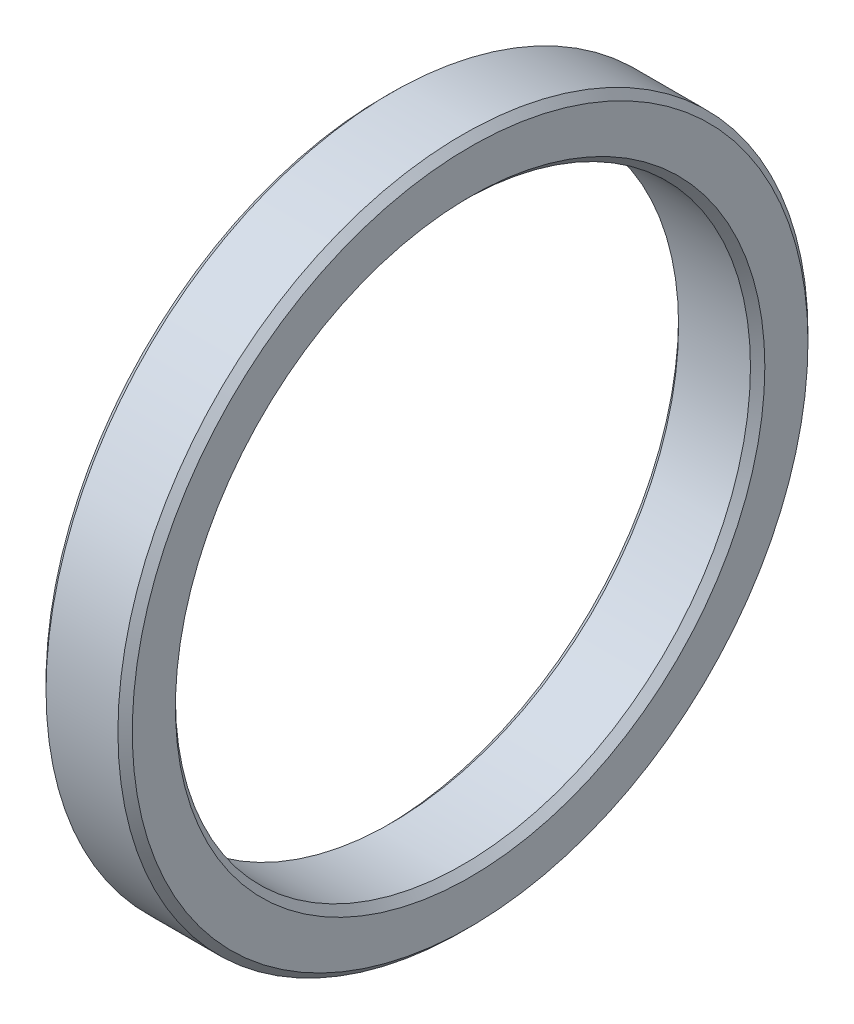
ISO-10303-21;
HEADER;
FILE_DESCRIPTION(('STEP AP214'),'2;1');
FILE_NAME('part.step','',(''),(''),'','','');
FILE_SCHEMA(('AUTOMOTIVE_DESIGN { 1 0 10303 214 1 1 1 1 }'));
ENDSEC;
DATA;
#1=APPLICATION_CONTEXT('core data for automotive mechanical design processes');
#2=APPLICATION_PROTOCOL_DEFINITION('international standard','automotive_design',2000,#1);
#3=PRODUCT_CONTEXT('',#1,'mechanical');
#4=PRODUCT('Part','Part','',(#3));
#5=PRODUCT_RELATED_PRODUCT_CATEGORY('part','',(#4));
#6=PRODUCT_DEFINITION_FORMATION('','',#4);
#7=PRODUCT_DEFINITION_CONTEXT('part definition',#1,'design');
#8=PRODUCT_DEFINITION('design','',#6,#7);
#9=PRODUCT_DEFINITION_SHAPE('','',#8);
#10=(LENGTH_UNIT() NAMED_UNIT(*) SI_UNIT(.MILLI.,.METRE.));
#11=(NAMED_UNIT(*) PLANE_ANGLE_UNIT() SI_UNIT($,.RADIAN.));
#12=(NAMED_UNIT(*) SI_UNIT($,.STERADIAN.) SOLID_ANGLE_UNIT());
#13=UNCERTAINTY_MEASURE_WITH_UNIT(LENGTH_MEASURE(1.E-05),#10,'distance_accuracy_value','');
#14=(GEOMETRIC_REPRESENTATION_CONTEXT(3) GLOBAL_UNCERTAINTY_ASSIGNED_CONTEXT((#13)) GLOBAL_UNIT_ASSIGNED_CONTEXT((#10,
#11,#12)) REPRESENTATION_CONTEXT('',''));
#15=CARTESIAN_POINT('',(0.,0.,0.));
#16=DIRECTION('',(0.,0.,1.));
#17=DIRECTION('',(1.,0.,0.));
#18=AXIS2_PLACEMENT_3D('',#15,#16,#17);
#19=CARTESIAN_POINT('',(6.,0.,0.));
#20=DIRECTION('',(1.,0.,0.));
#21=DIRECTION('',(0.,0.,-1.));
#22=AXIS2_PLACEMENT_3D('',#19,#20,#21);
#23=PLANE('',#22);
#24=CARTESIAN_POINT('',(6.,0.,0.));
#25=DIRECTION('',(1.,0.,0.));
#26=DIRECTION('',(0.,0.,-1.));
#27=AXIS2_PLACEMENT_3D('',#24,#25,#26);
#28=CIRCLE('',#27,23.5);
#29=CARTESIAN_POINT('',(6.,0.,-23.5));
#30=VERTEX_POINT('',#29);
#31=EDGE_CURVE('E47',#30,#30,#28,.T.);
#32=ORIENTED_EDGE('',*,*,#31,.T.);
#33=EDGE_LOOP('',(#32));
#34=FACE_BOUND('',#33,.T.);
#35=CARTESIAN_POINT('',(6.,0.,0.));
#36=DIRECTION('',(1.,0.,0.));
#37=DIRECTION('',(0.,0.,-1.));
#38=AXIS2_PLACEMENT_3D('',#35,#36,#37);
#39=CIRCLE('',#38,20.5);
#40=CARTESIAN_POINT('',(6.,0.,-20.5));
#41=VERTEX_POINT('',#40);
#42=EDGE_CURVE('E51',#41,#41,#39,.F.);
#43=ORIENTED_EDGE('',*,*,#42,.T.);
#44=EDGE_LOOP('',(#43));
#45=FACE_BOUND('',#44,.T.);
#46=ADVANCED_FACE('F35',(#34,#45),#23,.T.);
#47=CARTESIAN_POINT('',(0.,0.,0.));
#48=DIRECTION('',(1.,0.,0.));
#49=DIRECTION('',(0.,0.,-1.));
#50=AXIS2_PLACEMENT_3D('',#47,#48,#49);
#51=PLANE('',#50);
#52=CARTESIAN_POINT('',(0.,0.,0.));
#53=DIRECTION('',(1.,0.,0.));
#54=DIRECTION('',(0.,0.,-1.));
#55=AXIS2_PLACEMENT_3D('',#52,#53,#54);
#56=CIRCLE('',#55,23.5);
#57=CARTESIAN_POINT('',(0.,0.,-23.5));
#58=VERTEX_POINT('',#57);
#59=EDGE_CURVE('E56',#58,#58,#56,.F.);
#60=ORIENTED_EDGE('',*,*,#59,.T.);
#61=EDGE_LOOP('',(#60));
#62=FACE_BOUND('',#61,.T.);
#63=CARTESIAN_POINT('',(0.,0.,0.));
#64=DIRECTION('',(1.,0.,0.));
#65=DIRECTION('',(0.,0.,-1.));
#66=AXIS2_PLACEMENT_3D('',#63,#64,#65);
#67=CIRCLE('',#66,20.5);
#68=CARTESIAN_POINT('',(0.,0.,-20.5));
#69=VERTEX_POINT('',#68);
#70=EDGE_CURVE('E59',#69,#69,#67,.T.);
#71=ORIENTED_EDGE('',*,*,#70,.T.);
#72=EDGE_LOOP('',(#71));
#73=FACE_BOUND('',#72,.T.);
#74=ADVANCED_FACE('F81',(#62,#73),#51,.F.);
#75=CARTESIAN_POINT('',(6.,0.,0.));
#76=DIRECTION('',(-1.,0.,0.));
#77=DIRECTION('',(0.,0.,1.));
#78=AXIS2_PLACEMENT_3D('',#75,#76,#77);
#79=CYLINDRICAL_SURFACE('',#78,24.);
#80=CARTESIAN_POINT('',(0.5,0.,0.));
#81=DIRECTION('',(1.,0.,0.));
#82=DIRECTION('',(0.,0.,-1.));
#83=AXIS2_PLACEMENT_3D('',#80,#81,#82);
#84=CIRCLE('',#83,24.);
#85=CARTESIAN_POINT('',(0.5,0.,-24.));
#86=VERTEX_POINT('',#85);
#87=EDGE_CURVE('E62',#86,#86,#84,.T.);
#88=ORIENTED_EDGE('',*,*,#87,.T.);
#89=EDGE_LOOP('',(#88));
#90=FACE_BOUND('',#89,.T.);
#91=CARTESIAN_POINT('',(5.5,0.,0.));
#92=DIRECTION('',(1.,0.,0.));
#93=DIRECTION('',(0.,0.,-1.));
#94=AXIS2_PLACEMENT_3D('',#91,#92,#93);
#95=CIRCLE('',#94,24.);
#96=CARTESIAN_POINT('',(5.5,0.,-24.));
#97=VERTEX_POINT('',#96);
#98=EDGE_CURVE('E65',#97,#97,#95,.F.);
#99=ORIENTED_EDGE('',*,*,#98,.T.);
#100=EDGE_LOOP('',(#99));
#101=FACE_BOUND('',#100,.T.);
#102=ADVANCED_FACE('F69',(#90,#101),#79,.T.);
#103=CARTESIAN_POINT('',(6.,0.,0.));
#104=DIRECTION('',(-1.,0.,0.));
#105=DIRECTION('',(0.,0.,1.));
#106=AXIS2_PLACEMENT_3D('',#103,#104,#105);
#107=CYLINDRICAL_SURFACE('',#106,20.);
#108=CARTESIAN_POINT('',(0.500000000000004,0.,0.));
#109=DIRECTION('',(1.,0.,0.));
#110=DIRECTION('',(0.,0.,-1.));
#111=AXIS2_PLACEMENT_3D('',#108,#109,#110);
#112=CIRCLE('',#111,20.);
#113=CARTESIAN_POINT('',(0.500000000000004,0.,-20.));
#114=VERTEX_POINT('',#113);
#115=EDGE_CURVE('E10',#114,#114,#112,.F.);
#116=ORIENTED_EDGE('',*,*,#115,.T.);
#117=EDGE_LOOP('',(#116));
#118=FACE_BOUND('',#117,.T.);
#119=CARTESIAN_POINT('',(5.50000000000001,0.,0.));
#120=DIRECTION('',(1.,0.,0.));
#121=DIRECTION('',(0.,0.,-1.));
#122=AXIS2_PLACEMENT_3D('',#119,#120,#121);
#123=CIRCLE('',#122,20.);
#124=CARTESIAN_POINT('',(5.50000000000001,0.,-20.));
#125=VERTEX_POINT('',#124);
#126=EDGE_CURVE('E43',#125,#125,#123,.T.);
#127=ORIENTED_EDGE('',*,*,#126,.T.);
#128=EDGE_LOOP('',(#127));
#129=FACE_BOUND('',#128,.T.);
#130=ADVANCED_FACE('F106',(#118,#129),#107,.F.);
#131=CARTESIAN_POINT('',(0.5,0.,0.));
#132=DIRECTION('',(1.,0.,0.));
#133=DIRECTION('',(0.,0.,-1.));
#134=AXIS2_PLACEMENT_3D('',#131,#132,#133);
#135=CONICAL_SURFACE('',#134,24.,0.785398163397448);
#136=ORIENTED_EDGE('',*,*,#59,.F.);
#137=EDGE_LOOP('',(#136));
#138=FACE_BOUND('',#137,.T.);
#139=ORIENTED_EDGE('',*,*,#87,.F.);
#140=EDGE_LOOP('',(#139));
#141=FACE_BOUND('',#140,.T.);
#142=ADVANCED_FACE('F75',(#138,#141),#135,.T.);
#143=CARTESIAN_POINT('',(6.,0.,0.));
#144=DIRECTION('',(-1.,0.,0.));
#145=DIRECTION('',(0.,0.,1.));
#146=AXIS2_PLACEMENT_3D('',#143,#144,#145);
#147=CONICAL_SURFACE('',#146,23.5,0.785398163397445);
#148=ORIENTED_EDGE('',*,*,#98,.F.);
#149=EDGE_LOOP('',(#148));
#150=FACE_BOUND('',#149,.T.);
#151=ORIENTED_EDGE('',*,*,#31,.F.);
#152=EDGE_LOOP('',(#151));
#153=FACE_BOUND('',#152,.T.);
#154=ADVANCED_FACE('F71',(#150,#153),#147,.T.);
#155=CARTESIAN_POINT('',(0.,0.,0.));
#156=DIRECTION('',(-1.,0.,0.));
#157=DIRECTION('',(0.,0.,1.));
#158=AXIS2_PLACEMENT_3D('',#155,#156,#157);
#159=CONICAL_SURFACE('',#158,20.5,0.785398163397441);
#160=ORIENTED_EDGE('',*,*,#115,.F.);
#161=EDGE_LOOP('',(#160));
#162=FACE_BOUND('',#161,.T.);
#163=ORIENTED_EDGE('',*,*,#70,.F.);
#164=EDGE_LOOP('',(#163));
#165=FACE_BOUND('',#164,.T.);
#166=ADVANCED_FACE('F74',(#162,#165),#159,.F.);
#167=CARTESIAN_POINT('',(5.50000000000001,0.,0.));
#168=DIRECTION('',(1.,0.,0.));
#169=DIRECTION('',(0.,0.,-1.));
#170=AXIS2_PLACEMENT_3D('',#167,#168,#169);
#171=CONICAL_SURFACE('',#170,20.,0.785398163397448);
#172=ORIENTED_EDGE('',*,*,#42,.F.);
#173=EDGE_LOOP('',(#172));
#174=FACE_BOUND('',#173,.T.);
#175=ORIENTED_EDGE('',*,*,#126,.F.);
#176=EDGE_LOOP('',(#175));
#177=FACE_BOUND('',#176,.T.);
#178=ADVANCED_FACE('F38',(#174,#177),#171,.F.);
#179=CLOSED_SHELL('',(#46,#74,#102,#130,#142,#154,#166,#178));
#180=MANIFOLD_SOLID_BREP('B2',#179);
#181=ADVANCED_BREP_SHAPE_REPRESENTATION('',(#18,#180),#14);
#182=SHAPE_DEFINITION_REPRESENTATION(#9,#181);
ENDSEC;
END-ISO-10303-21;
